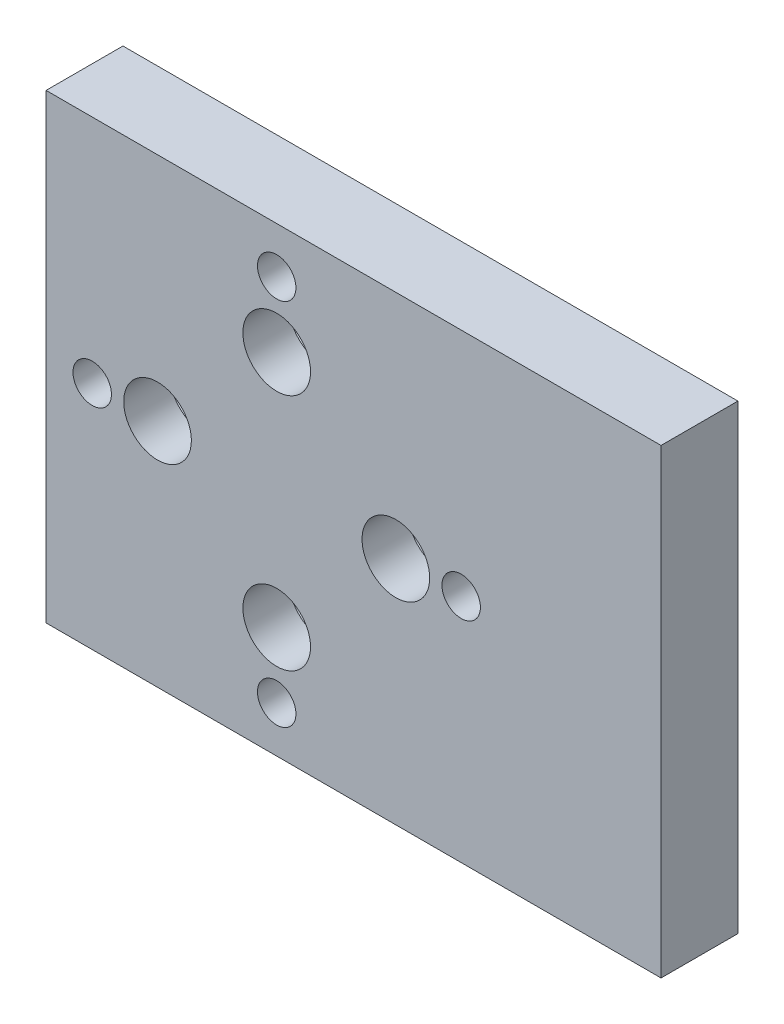
ISO-10303-21;
HEADER;
FILE_DESCRIPTION(('STEP AP214'),'2;1');
FILE_NAME('part.step','',(''),(''),'','','');
FILE_SCHEMA(('AUTOMOTIVE_DESIGN { 1 0 10303 214 1 1 1 1 }'));
ENDSEC;
DATA;
#1=APPLICATION_CONTEXT('core data for automotive mechanical design processes');
#2=APPLICATION_PROTOCOL_DEFINITION('international standard','automotive_design',2000,#1);
#3=PRODUCT_CONTEXT('',#1,'mechanical');
#4=PRODUCT('Part','Part','',(#3));
#5=PRODUCT_RELATED_PRODUCT_CATEGORY('part','',(#4));
#6=PRODUCT_DEFINITION_FORMATION('','',#4);
#7=PRODUCT_DEFINITION_CONTEXT('part definition',#1,'design');
#8=PRODUCT_DEFINITION('design','',#6,#7);
#9=PRODUCT_DEFINITION_SHAPE('','',#8);
#10=(LENGTH_UNIT() NAMED_UNIT(*) SI_UNIT(.MILLI.,.METRE.));
#11=(NAMED_UNIT(*) PLANE_ANGLE_UNIT() SI_UNIT($,.RADIAN.));
#12=(NAMED_UNIT(*) SI_UNIT($,.STERADIAN.) SOLID_ANGLE_UNIT());
#13=UNCERTAINTY_MEASURE_WITH_UNIT(LENGTH_MEASURE(1.E-05),#10,'distance_accuracy_value','');
#14=(GEOMETRIC_REPRESENTATION_CONTEXT(3) GLOBAL_UNCERTAINTY_ASSIGNED_CONTEXT((#13)) GLOBAL_UNIT_ASSIGNED_CONTEXT((#10,
#11,#12)) REPRESENTATION_CONTEXT('',''));
#15=CARTESIAN_POINT('',(0.,0.,0.));
#16=DIRECTION('',(0.,0.,1.));
#17=DIRECTION('',(1.,0.,0.));
#18=AXIS2_PLACEMENT_3D('',#15,#16,#17);
#19=CARTESIAN_POINT('',(40.,30.,10.));
#20=DIRECTION('',(-1.,0.,0.));
#21=DIRECTION('',(0.,0.,1.));
#22=AXIS2_PLACEMENT_3D('',#19,#20,#21);
#23=PLANE('',#22);
#24=DIRECTION('',(0.,1.,0.));
#25=VECTOR('',#24,1.);
#26=CARTESIAN_POINT('',(40.,30.,0.));
#27=LINE('',#26,#25);
#28=CARTESIAN_POINT('',(40.,-30.,0.));
#29=VERTEX_POINT('',#28);
#30=CARTESIAN_POINT('',(40.,30.,0.));
#31=VERTEX_POINT('',#30);
#32=EDGE_CURVE('E167',#29,#31,#27,.T.);
#33=ORIENTED_EDGE('',*,*,#32,.T.);
#34=DIRECTION('',(0.,0.,-1.));
#35=VECTOR('',#34,1.);
#36=CARTESIAN_POINT('',(40.,30.,10.));
#37=LINE('',#36,#35);
#38=CARTESIAN_POINT('',(40.,30.,10.));
#39=VERTEX_POINT('',#38);
#40=EDGE_CURVE('E11',#39,#31,#37,.T.);
#41=ORIENTED_EDGE('',*,*,#40,.F.);
#42=DIRECTION('',(0.,1.,0.));
#43=VECTOR('',#42,1.);
#44=CARTESIAN_POINT('',(40.,30.,10.));
#45=LINE('',#44,#43);
#46=CARTESIAN_POINT('',(40.,-30.,10.));
#47=VERTEX_POINT('',#46);
#48=EDGE_CURVE('E168',#47,#39,#45,.T.);
#49=ORIENTED_EDGE('',*,*,#48,.F.);
#50=DIRECTION('',(0.,0.,-1.));
#51=VECTOR('',#50,1.);
#52=CARTESIAN_POINT('',(40.,-30.,10.));
#53=LINE('',#52,#51);
#54=EDGE_CURVE('E174',#47,#29,#53,.T.);
#55=ORIENTED_EDGE('',*,*,#54,.T.);
#56=EDGE_LOOP('',(#33,#41,#49,#55));
#57=FACE_BOUND('',#56,.T.);
#58=ADVANCED_FACE('F33',(#57),#23,.F.);
#59=CARTESIAN_POINT('',(-40.,30.,10.));
#60=DIRECTION('',(0.,-1.,0.));
#61=DIRECTION('',(0.,0.,-1.));
#62=AXIS2_PLACEMENT_3D('',#59,#60,#61);
#63=PLANE('',#62);
#64=DIRECTION('',(-1.,0.,0.));
#65=VECTOR('',#64,1.);
#66=CARTESIAN_POINT('',(-40.,30.,0.));
#67=LINE('',#66,#65);
#68=CARTESIAN_POINT('',(-40.,30.,0.));
#69=VERTEX_POINT('',#68);
#70=EDGE_CURVE('E177',#31,#69,#67,.T.);
#71=ORIENTED_EDGE('',*,*,#70,.T.);
#72=DIRECTION('',(0.,0.,-1.));
#73=VECTOR('',#72,1.);
#74=CARTESIAN_POINT('',(-40.,30.,10.));
#75=LINE('',#74,#73);
#76=CARTESIAN_POINT('',(-40.,30.,10.));
#77=VERTEX_POINT('',#76);
#78=EDGE_CURVE('E42',#77,#69,#75,.T.);
#79=ORIENTED_EDGE('',*,*,#78,.F.);
#80=DIRECTION('',(-1.,0.,0.));
#81=VECTOR('',#80,1.);
#82=CARTESIAN_POINT('',(-40.,30.,10.));
#83=LINE('',#82,#81);
#84=EDGE_CURVE('E82',#39,#77,#83,.T.);
#85=ORIENTED_EDGE('',*,*,#84,.F.);
#86=ORIENTED_EDGE('',*,*,#40,.T.);
#87=EDGE_LOOP('',(#71,#79,#85,#86));
#88=FACE_BOUND('',#87,.T.);
#89=ADVANCED_FACE('F211',(#88),#63,.F.);
#90=CARTESIAN_POINT('',(-40.,30.,10.));
#91=DIRECTION('',(1.,0.,0.));
#92=DIRECTION('',(0.,0.,-1.));
#93=AXIS2_PLACEMENT_3D('',#90,#91,#92);
#94=PLANE('',#93);
#95=DIRECTION('',(0.,-1.,0.));
#96=VECTOR('',#95,1.);
#97=CARTESIAN_POINT('',(-40.,30.,0.));
#98=LINE('',#97,#96);
#99=CARTESIAN_POINT('',(-40.,-30.,0.));
#100=VERTEX_POINT('',#99);
#101=EDGE_CURVE('E69',#69,#100,#98,.T.);
#102=ORIENTED_EDGE('',*,*,#101,.T.);
#103=DIRECTION('',(0.,0.,-1.));
#104=VECTOR('',#103,1.);
#105=CARTESIAN_POINT('',(-40.,-30.,10.));
#106=LINE('',#105,#104);
#107=CARTESIAN_POINT('',(-40.,-30.,10.));
#108=VERTEX_POINT('',#107);
#109=EDGE_CURVE('E182',#108,#100,#106,.T.);
#110=ORIENTED_EDGE('',*,*,#109,.F.);
#111=DIRECTION('',(0.,-1.,0.));
#112=VECTOR('',#111,1.);
#113=CARTESIAN_POINT('',(-40.,30.,10.));
#114=LINE('',#113,#112);
#115=EDGE_CURVE('E171',#77,#108,#114,.T.);
#116=ORIENTED_EDGE('',*,*,#115,.F.);
#117=ORIENTED_EDGE('',*,*,#78,.T.);
#118=EDGE_LOOP('',(#102,#110,#116,#117));
#119=FACE_BOUND('',#118,.T.);
#120=ADVANCED_FACE('F216',(#119),#94,.F.);
#121=CARTESIAN_POINT('',(-40.,-30.,10.));
#122=DIRECTION('',(0.,1.,0.));
#123=DIRECTION('',(0.,0.,1.));
#124=AXIS2_PLACEMENT_3D('',#121,#122,#123);
#125=PLANE('',#124);
#126=DIRECTION('',(1.,0.,0.));
#127=VECTOR('',#126,1.);
#128=CARTESIAN_POINT('',(-40.,-30.,0.));
#129=LINE('',#128,#127);
#130=EDGE_CURVE('E75',#100,#29,#129,.T.);
#131=ORIENTED_EDGE('',*,*,#130,.T.);
#132=ORIENTED_EDGE('',*,*,#54,.F.);
#133=DIRECTION('',(1.,0.,0.));
#134=VECTOR('',#133,1.);
#135=CARTESIAN_POINT('',(-40.,-30.,10.));
#136=LINE('',#135,#134);
#137=EDGE_CURVE('E51',#108,#47,#136,.T.);
#138=ORIENTED_EDGE('',*,*,#137,.F.);
#139=ORIENTED_EDGE('',*,*,#109,.T.);
#140=EDGE_LOOP('',(#131,#132,#138,#139));
#141=FACE_BOUND('',#140,.T.);
#142=ADVANCED_FACE('F225',(#141),#125,.F.);
#143=CARTESIAN_POINT('',(0.,0.,10.));
#144=DIRECTION('',(0.,0.,1.));
#145=DIRECTION('',(1.,0.,0.));
#146=AXIS2_PLACEMENT_3D('',#143,#144,#145);
#147=PLANE('',#146);
#148=CARTESIAN_POINT('',(-9.99999999999999,24.,10.));
#149=DIRECTION('',(0.,0.,1.));
#150=DIRECTION('',(1.,0.,0.));
#151=AXIS2_PLACEMENT_3D('',#148,#149,#150);
#152=CIRCLE('',#151,2.5);
#153=CARTESIAN_POINT('',(-7.5,24.,10.));
#154=VERTEX_POINT('',#153);
#155=EDGE_CURVE('E106',#154,#154,#152,.T.);
#156=ORIENTED_EDGE('',*,*,#155,.F.);
#157=EDGE_LOOP('',(#156));
#158=FACE_BOUND('',#157,.T.);
#159=CARTESIAN_POINT('',(-34.,0.,10.));
#160=DIRECTION('',(0.,0.,1.));
#161=DIRECTION('',(1.,0.,0.));
#162=AXIS2_PLACEMENT_3D('',#159,#160,#161);
#163=CIRCLE('',#162,2.5);
#164=CARTESIAN_POINT('',(-31.5,0.,10.));
#165=VERTEX_POINT('',#164);
#166=EDGE_CURVE('E105',#165,#165,#163,.T.);
#167=ORIENTED_EDGE('',*,*,#166,.F.);
#168=EDGE_LOOP('',(#167));
#169=FACE_BOUND('',#168,.T.);
#170=CARTESIAN_POINT('',(-9.99999999999999,-24.,10.));
#171=DIRECTION('',(0.,0.,1.));
#172=DIRECTION('',(1.,0.,0.));
#173=AXIS2_PLACEMENT_3D('',#170,#171,#172);
#174=CIRCLE('',#173,2.5);
#175=CARTESIAN_POINT('',(-7.5,-24.,10.));
#176=VERTEX_POINT('',#175);
#177=EDGE_CURVE('E116',#176,#176,#174,.T.);
#178=ORIENTED_EDGE('',*,*,#177,.F.);
#179=EDGE_LOOP('',(#178));
#180=FACE_BOUND('',#179,.T.);
#181=CARTESIAN_POINT('',(14.,0.,10.));
#182=DIRECTION('',(0.,0.,1.));
#183=DIRECTION('',(1.,0.,0.));
#184=AXIS2_PLACEMENT_3D('',#181,#182,#183);
#185=CIRCLE('',#184,2.5);
#186=CARTESIAN_POINT('',(16.5,0.,10.));
#187=VERTEX_POINT('',#186);
#188=EDGE_CURVE('E122',#187,#187,#185,.T.);
#189=ORIENTED_EDGE('',*,*,#188,.F.);
#190=EDGE_LOOP('',(#189));
#191=FACE_BOUND('',#190,.T.);
#192=CARTESIAN_POINT('',(-25.5,0.,10.));
#193=DIRECTION('',(0.,0.,1.));
#194=DIRECTION('',(1.,0.,0.));
#195=AXIS2_PLACEMENT_3D('',#192,#193,#194);
#196=CIRCLE('',#195,4.39999999999999);
#197=CARTESIAN_POINT('',(-21.1,0.,10.));
#198=VERTEX_POINT('',#197);
#199=EDGE_CURVE('E128',#198,#198,#196,.T.);
#200=ORIENTED_EDGE('',*,*,#199,.F.);
#201=EDGE_LOOP('',(#200));
#202=FACE_BOUND('',#201,.T.);
#203=CARTESIAN_POINT('',(-9.99999999999999,15.5,10.));
#204=DIRECTION('',(0.,0.,1.));
#205=DIRECTION('',(1.,0.,0.));
#206=AXIS2_PLACEMENT_3D('',#203,#204,#205);
#207=CIRCLE('',#206,4.39999999999999);
#208=CARTESIAN_POINT('',(-5.6,15.5,10.));
#209=VERTEX_POINT('',#208);
#210=EDGE_CURVE('E134',#209,#209,#207,.T.);
#211=ORIENTED_EDGE('',*,*,#210,.F.);
#212=EDGE_LOOP('',(#211));
#213=FACE_BOUND('',#212,.T.);
#214=CARTESIAN_POINT('',(5.50000000000001,0.,10.));
#215=DIRECTION('',(0.,0.,1.));
#216=DIRECTION('',(1.,0.,0.));
#217=AXIS2_PLACEMENT_3D('',#214,#215,#216);
#218=CIRCLE('',#217,4.39999999999999);
#219=CARTESIAN_POINT('',(9.89999999999999,0.,10.));
#220=VERTEX_POINT('',#219);
#221=EDGE_CURVE('E141',#220,#220,#218,.T.);
#222=ORIENTED_EDGE('',*,*,#221,.F.);
#223=EDGE_LOOP('',(#222));
#224=FACE_BOUND('',#223,.T.);
#225=CARTESIAN_POINT('',(-9.99999999999999,-15.5,10.));
#226=DIRECTION('',(0.,0.,1.));
#227=DIRECTION('',(1.,0.,0.));
#228=AXIS2_PLACEMENT_3D('',#225,#226,#227);
#229=CIRCLE('',#228,4.39999999999999);
#230=CARTESIAN_POINT('',(-5.6,-15.5,10.));
#231=VERTEX_POINT('',#230);
#232=EDGE_CURVE('E148',#231,#231,#229,.T.);
#233=ORIENTED_EDGE('',*,*,#232,.F.);
#234=EDGE_LOOP('',(#233));
#235=FACE_BOUND('',#234,.T.);
#236=ORIENTED_EDGE('',*,*,#48,.T.);
#237=ORIENTED_EDGE('',*,*,#84,.T.);
#238=ORIENTED_EDGE('',*,*,#115,.T.);
#239=ORIENTED_EDGE('',*,*,#137,.T.);
#240=EDGE_LOOP('',(#236,#237,#238,#239));
#241=FACE_BOUND('',#240,.T.);
#242=ADVANCED_FACE('F223',(#158,#169,#180,#191,#202,#213,#224,#235,#241),#147,.T.);
#243=CARTESIAN_POINT('',(0.,0.,0.));
#244=DIRECTION('',(0.,0.,1.));
#245=DIRECTION('',(1.,0.,0.));
#246=AXIS2_PLACEMENT_3D('',#243,#244,#245);
#247=PLANE('',#246);
#248=CARTESIAN_POINT('',(-25.5,0.,0.));
#249=DIRECTION('',(0.,0.,1.));
#250=DIRECTION('',(1.,0.,0.));
#251=AXIS2_PLACEMENT_3D('',#248,#249,#250);
#252=CIRCLE('',#251,2.1);
#253=CARTESIAN_POINT('',(-23.4,0.,0.));
#254=VERTEX_POINT('',#253);
#255=EDGE_CURVE('E155',#254,#254,#252,.T.);
#256=ORIENTED_EDGE('',*,*,#255,.T.);
#257=EDGE_LOOP('',(#256));
#258=FACE_BOUND('',#257,.T.);
#259=CARTESIAN_POINT('',(-9.99999999999999,-15.5,0.));
#260=DIRECTION('',(0.,0.,1.));
#261=DIRECTION('',(1.,0.,0.));
#262=AXIS2_PLACEMENT_3D('',#259,#260,#261);
#263=CIRCLE('',#262,2.1);
#264=CARTESIAN_POINT('',(-7.89999999999999,-15.5,0.));
#265=VERTEX_POINT('',#264);
#266=EDGE_CURVE('E158',#265,#265,#263,.T.);
#267=ORIENTED_EDGE('',*,*,#266,.T.);
#268=EDGE_LOOP('',(#267));
#269=FACE_BOUND('',#268,.T.);
#270=CARTESIAN_POINT('',(5.50000000000001,0.,0.));
#271=DIRECTION('',(0.,0.,1.));
#272=DIRECTION('',(1.,0.,0.));
#273=AXIS2_PLACEMENT_3D('',#270,#271,#272);
#274=CIRCLE('',#273,2.1);
#275=CARTESIAN_POINT('',(7.6,0.,0.));
#276=VERTEX_POINT('',#275);
#277=EDGE_CURVE('E161',#276,#276,#274,.T.);
#278=ORIENTED_EDGE('',*,*,#277,.T.);
#279=EDGE_LOOP('',(#278));
#280=FACE_BOUND('',#279,.T.);
#281=CARTESIAN_POINT('',(-9.99999999999999,15.5,0.));
#282=DIRECTION('',(0.,0.,1.));
#283=DIRECTION('',(1.,0.,0.));
#284=AXIS2_PLACEMENT_3D('',#281,#282,#283);
#285=CIRCLE('',#284,2.1);
#286=CARTESIAN_POINT('',(-7.89999999999999,15.5,0.));
#287=VERTEX_POINT('',#286);
#288=EDGE_CURVE('E164',#287,#287,#285,.T.);
#289=ORIENTED_EDGE('',*,*,#288,.T.);
#290=EDGE_LOOP('',(#289));
#291=FACE_BOUND('',#290,.T.);
#292=ORIENTED_EDGE('',*,*,#32,.F.);
#293=ORIENTED_EDGE('',*,*,#130,.F.);
#294=ORIENTED_EDGE('',*,*,#101,.F.);
#295=ORIENTED_EDGE('',*,*,#70,.F.);
#296=EDGE_LOOP('',(#292,#293,#294,#295));
#297=FACE_BOUND('',#296,.T.);
#298=ADVANCED_FACE('F221',(#258,#269,#280,#291,#297),#247,.F.);
#299=CARTESIAN_POINT('',(-9.99999999999999,15.5,10.));
#300=DIRECTION('',(0.,0.,1.));
#301=DIRECTION('',(1.,0.,0.));
#302=AXIS2_PLACEMENT_3D('',#299,#300,#301);
#303=CYLINDRICAL_SURFACE('',#302,2.09999999999999);
#304=CARTESIAN_POINT('',(-9.99999999999999,15.5,2.6180205762366));
#305=DIRECTION('',(0.,0.,1.));
#306=DIRECTION('',(1.,0.,0.));
#307=AXIS2_PLACEMENT_3D('',#304,#305,#306);
#308=CIRCLE('',#307,2.09999999999999);
#309=CARTESIAN_POINT('',(-7.9,15.5,2.6180205762366));
#310=VERTEX_POINT('',#309);
#311=EDGE_CURVE('E140',#310,#310,#308,.T.);
#312=ORIENTED_EDGE('',*,*,#311,.T.);
#313=EDGE_LOOP('',(#312));
#314=FACE_BOUND('',#313,.T.);
#315=ORIENTED_EDGE('',*,*,#288,.F.);
#316=EDGE_LOOP('',(#315));
#317=FACE_BOUND('',#316,.T.);
#318=ADVANCED_FACE('F191',(#314,#317),#303,.F.);
#319=CARTESIAN_POINT('',(5.50000000000001,0.,10.));
#320=DIRECTION('',(0.,0.,1.));
#321=DIRECTION('',(1.,0.,0.));
#322=AXIS2_PLACEMENT_3D('',#319,#320,#321);
#323=CYLINDRICAL_SURFACE('',#322,2.09999999999999);
#324=CARTESIAN_POINT('',(5.50000000000001,0.,2.6180205762366));
#325=DIRECTION('',(0.,0.,1.));
#326=DIRECTION('',(1.,0.,0.));
#327=AXIS2_PLACEMENT_3D('',#324,#325,#326);
#328=CIRCLE('',#327,2.09999999999999);
#329=CARTESIAN_POINT('',(7.6,0.,2.6180205762366));
#330=VERTEX_POINT('',#329);
#331=EDGE_CURVE('E147',#330,#330,#328,.T.);
#332=ORIENTED_EDGE('',*,*,#331,.T.);
#333=EDGE_LOOP('',(#332));
#334=FACE_BOUND('',#333,.T.);
#335=ORIENTED_EDGE('',*,*,#277,.F.);
#336=EDGE_LOOP('',(#335));
#337=FACE_BOUND('',#336,.T.);
#338=ADVANCED_FACE('F265',(#334,#337),#323,.F.);
#339=CARTESIAN_POINT('',(-9.99999999999999,-15.5,10.));
#340=DIRECTION('',(0.,0.,1.));
#341=DIRECTION('',(1.,0.,0.));
#342=AXIS2_PLACEMENT_3D('',#339,#340,#341);
#343=CYLINDRICAL_SURFACE('',#342,2.09999999999999);
#344=CARTESIAN_POINT('',(-9.99999999999999,-15.5,2.6180205762366));
#345=DIRECTION('',(0.,0.,1.));
#346=DIRECTION('',(1.,0.,0.));
#347=AXIS2_PLACEMENT_3D('',#344,#345,#346);
#348=CIRCLE('',#347,2.09999999999999);
#349=CARTESIAN_POINT('',(-7.9,-15.5,2.6180205762366));
#350=VERTEX_POINT('',#349);
#351=EDGE_CURVE('E154',#350,#350,#348,.T.);
#352=ORIENTED_EDGE('',*,*,#351,.T.);
#353=EDGE_LOOP('',(#352));
#354=FACE_BOUND('',#353,.T.);
#355=ORIENTED_EDGE('',*,*,#266,.F.);
#356=EDGE_LOOP('',(#355));
#357=FACE_BOUND('',#356,.T.);
#358=ADVANCED_FACE('F273',(#354,#357),#343,.F.);
#359=CARTESIAN_POINT('',(-25.5,0.,10.));
#360=DIRECTION('',(0.,0.,1.));
#361=DIRECTION('',(1.,0.,0.));
#362=AXIS2_PLACEMENT_3D('',#359,#360,#361);
#363=CYLINDRICAL_SURFACE('',#362,2.09999999999999);
#364=CARTESIAN_POINT('',(-25.5,0.,2.6180205762366));
#365=DIRECTION('',(0.,0.,1.));
#366=DIRECTION('',(1.,0.,0.));
#367=AXIS2_PLACEMENT_3D('',#364,#365,#366);
#368=CIRCLE('',#367,2.09999999999999);
#369=CARTESIAN_POINT('',(-23.4,0.,2.6180205762366));
#370=VERTEX_POINT('',#369);
#371=EDGE_CURVE('E36',#370,#370,#368,.T.);
#372=ORIENTED_EDGE('',*,*,#371,.T.);
#373=EDGE_LOOP('',(#372));
#374=FACE_BOUND('',#373,.T.);
#375=ORIENTED_EDGE('',*,*,#255,.F.);
#376=EDGE_LOOP('',(#375));
#377=FACE_BOUND('',#376,.T.);
#378=ADVANCED_FACE('F282',(#374,#377),#363,.F.);
#379=CARTESIAN_POINT('',(-9.99999999999999,-15.5,4.));
#380=DIRECTION('',(0.,0.,1.));
#381=DIRECTION('',(1.,0.,0.));
#382=AXIS2_PLACEMENT_3D('',#379,#380,#381);
#383=CONICAL_SURFACE('',#382,4.4,1.02974425867665);
#384=CARTESIAN_POINT('',(-9.99999999999999,-15.5,4.));
#385=DIRECTION('',(0.,0.,1.));
#386=DIRECTION('',(1.,0.,0.));
#387=AXIS2_PLACEMENT_3D('',#384,#385,#386);
#388=CIRCLE('',#387,4.4);
#389=CARTESIAN_POINT('',(-5.59999999999999,-15.5,4.));
#390=VERTEX_POINT('',#389);
#391=EDGE_CURVE('E151',#390,#390,#388,.T.);
#392=ORIENTED_EDGE('',*,*,#391,.T.);
#393=EDGE_LOOP('',(#392));
#394=FACE_BOUND('',#393,.T.);
#395=ORIENTED_EDGE('',*,*,#351,.F.);
#396=EDGE_LOOP('',(#395));
#397=FACE_BOUND('',#396,.T.);
#398=ADVANCED_FACE('F292',(#394,#397),#383,.F.);
#399=CARTESIAN_POINT('',(-9.99999999999999,-15.5,10.));
#400=DIRECTION('',(0.,0.,1.));
#401=DIRECTION('',(1.,0.,0.));
#402=AXIS2_PLACEMENT_3D('',#399,#400,#401);
#403=CYLINDRICAL_SURFACE('',#402,4.39999999999999);
#404=ORIENTED_EDGE('',*,*,#391,.F.);
#405=EDGE_LOOP('',(#404));
#406=FACE_BOUND('',#405,.T.);
#407=ORIENTED_EDGE('',*,*,#232,.T.);
#408=EDGE_LOOP('',(#407));
#409=FACE_BOUND('',#408,.T.);
#410=ADVANCED_FACE('F302',(#406,#409),#403,.F.);
#411=CARTESIAN_POINT('',(5.50000000000001,0.,4.));
#412=DIRECTION('',(0.,0.,1.));
#413=DIRECTION('',(1.,0.,0.));
#414=AXIS2_PLACEMENT_3D('',#411,#412,#413);
#415=CONICAL_SURFACE('',#414,4.4,1.02974425867665);
#416=CARTESIAN_POINT('',(5.50000000000001,0.,4.));
#417=DIRECTION('',(0.,0.,1.));
#418=DIRECTION('',(1.,0.,0.));
#419=AXIS2_PLACEMENT_3D('',#416,#417,#418);
#420=CIRCLE('',#419,4.4);
#421=CARTESIAN_POINT('',(9.9,0.,4.));
#422=VERTEX_POINT('',#421);
#423=EDGE_CURVE('E144',#422,#422,#420,.T.);
#424=ORIENTED_EDGE('',*,*,#423,.T.);
#425=EDGE_LOOP('',(#424));
#426=FACE_BOUND('',#425,.T.);
#427=ORIENTED_EDGE('',*,*,#331,.F.);
#428=EDGE_LOOP('',(#427));
#429=FACE_BOUND('',#428,.T.);
#430=ADVANCED_FACE('F207',(#426,#429),#415,.F.);
#431=CARTESIAN_POINT('',(5.50000000000001,0.,10.));
#432=DIRECTION('',(0.,0.,1.));
#433=DIRECTION('',(1.,0.,0.));
#434=AXIS2_PLACEMENT_3D('',#431,#432,#433);
#435=CYLINDRICAL_SURFACE('',#434,4.39999999999999);
#436=ORIENTED_EDGE('',*,*,#423,.F.);
#437=EDGE_LOOP('',(#436));
#438=FACE_BOUND('',#437,.T.);
#439=ORIENTED_EDGE('',*,*,#221,.T.);
#440=EDGE_LOOP('',(#439));
#441=FACE_BOUND('',#440,.T.);
#442=ADVANCED_FACE('F197',(#438,#441),#435,.F.);
#443=CARTESIAN_POINT('',(-9.99999999999999,15.5,4.));
#444=DIRECTION('',(0.,0.,1.));
#445=DIRECTION('',(1.,0.,0.));
#446=AXIS2_PLACEMENT_3D('',#443,#444,#445);
#447=CONICAL_SURFACE('',#446,4.4,1.02974425867665);
#448=CARTESIAN_POINT('',(-9.99999999999999,15.5,4.));
#449=DIRECTION('',(0.,0.,1.));
#450=DIRECTION('',(1.,0.,0.));
#451=AXIS2_PLACEMENT_3D('',#448,#449,#450);
#452=CIRCLE('',#451,4.4);
#453=CARTESIAN_POINT('',(-5.59999999999999,15.5,4.));
#454=VERTEX_POINT('',#453);
#455=EDGE_CURVE('E137',#454,#454,#452,.T.);
#456=ORIENTED_EDGE('',*,*,#455,.T.);
#457=EDGE_LOOP('',(#456));
#458=FACE_BOUND('',#457,.T.);
#459=ORIENTED_EDGE('',*,*,#311,.F.);
#460=EDGE_LOOP('',(#459));
#461=FACE_BOUND('',#460,.T.);
#462=ADVANCED_FACE('F194',(#458,#461),#447,.F.);
#463=CARTESIAN_POINT('',(-9.99999999999999,15.5,10.));
#464=DIRECTION('',(0.,0.,1.));
#465=DIRECTION('',(1.,0.,0.));
#466=AXIS2_PLACEMENT_3D('',#463,#464,#465);
#467=CYLINDRICAL_SURFACE('',#466,4.39999999999999);
#468=ORIENTED_EDGE('',*,*,#455,.F.);
#469=EDGE_LOOP('',(#468));
#470=FACE_BOUND('',#469,.T.);
#471=ORIENTED_EDGE('',*,*,#210,.T.);
#472=EDGE_LOOP('',(#471));
#473=FACE_BOUND('',#472,.T.);
#474=ADVANCED_FACE('F196',(#470,#473),#467,.F.);
#475=CARTESIAN_POINT('',(-25.5,0.,4.));
#476=DIRECTION('',(0.,0.,1.));
#477=DIRECTION('',(1.,0.,0.));
#478=AXIS2_PLACEMENT_3D('',#475,#476,#477);
#479=CONICAL_SURFACE('',#478,4.4,1.02974425867665);
#480=CARTESIAN_POINT('',(-25.5,0.,4.));
#481=DIRECTION('',(0.,0.,1.));
#482=DIRECTION('',(1.,0.,0.));
#483=AXIS2_PLACEMENT_3D('',#480,#481,#482);
#484=CIRCLE('',#483,4.4);
#485=CARTESIAN_POINT('',(-21.1,0.,4.));
#486=VERTEX_POINT('',#485);
#487=EDGE_CURVE('E131',#486,#486,#484,.T.);
#488=ORIENTED_EDGE('',*,*,#487,.T.);
#489=EDGE_LOOP('',(#488));
#490=FACE_BOUND('',#489,.T.);
#491=ORIENTED_EDGE('',*,*,#371,.F.);
#492=EDGE_LOOP('',(#491));
#493=FACE_BOUND('',#492,.T.);
#494=ADVANCED_FACE('F204',(#490,#493),#479,.F.);
#495=CARTESIAN_POINT('',(-25.5,0.,10.));
#496=DIRECTION('',(0.,0.,1.));
#497=DIRECTION('',(1.,0.,0.));
#498=AXIS2_PLACEMENT_3D('',#495,#496,#497);
#499=CYLINDRICAL_SURFACE('',#498,4.39999999999999);
#500=ORIENTED_EDGE('',*,*,#487,.F.);
#501=EDGE_LOOP('',(#500));
#502=FACE_BOUND('',#501,.T.);
#503=ORIENTED_EDGE('',*,*,#199,.T.);
#504=EDGE_LOOP('',(#503));
#505=FACE_BOUND('',#504,.T.);
#506=ADVANCED_FACE('F346',(#502,#505),#499,.F.);
#507=CARTESIAN_POINT('',(14.,0.,5.));
#508=DIRECTION('',(0.,0.,1.));
#509=DIRECTION('',(1.,0.,0.));
#510=AXIS2_PLACEMENT_3D('',#507,#508,#509);
#511=CONICAL_SURFACE('',#510,2.5,1.02974425867665);
#512=CARTESIAN_POINT('',(14.,0.,3.4978484524311));
#513=VERTEX_POINT('',#512);
#514=VERTEX_LOOP('',#513);
#515=FACE_BOUND('',#514,.T.);
#516=CARTESIAN_POINT('',(14.,0.,5.));
#517=DIRECTION('',(0.,0.,1.));
#518=DIRECTION('',(1.,0.,0.));
#519=AXIS2_PLACEMENT_3D('',#516,#517,#518);
#520=CIRCLE('',#519,2.5);
#521=CARTESIAN_POINT('',(16.5,0.,5.));
#522=VERTEX_POINT('',#521);
#523=EDGE_CURVE('E125',#522,#522,#520,.T.);
#524=ORIENTED_EDGE('',*,*,#523,.T.);
#525=EDGE_LOOP('',(#524));
#526=FACE_BOUND('',#525,.T.);
#527=ADVANCED_FACE('F355',(#515,#526),#511,.F.);
#528=CARTESIAN_POINT('',(14.,0.,10.));
#529=DIRECTION('',(0.,0.,1.));
#530=DIRECTION('',(1.,0.,0.));
#531=AXIS2_PLACEMENT_3D('',#528,#529,#530);
#532=CYLINDRICAL_SURFACE('',#531,2.5);
#533=ORIENTED_EDGE('',*,*,#523,.F.);
#534=EDGE_LOOP('',(#533));
#535=FACE_BOUND('',#534,.T.);
#536=ORIENTED_EDGE('',*,*,#188,.T.);
#537=EDGE_LOOP('',(#536));
#538=FACE_BOUND('',#537,.T.);
#539=ADVANCED_FACE('F369',(#535,#538),#532,.F.);
#540=CARTESIAN_POINT('',(-9.99999999999999,-24.,5.));
#541=DIRECTION('',(0.,0.,1.));
#542=DIRECTION('',(1.,0.,0.));
#543=AXIS2_PLACEMENT_3D('',#540,#541,#542);
#544=CONICAL_SURFACE('',#543,2.5,1.02974425867665);
#545=CARTESIAN_POINT('',(-10.,-24.,3.4978484524311));
#546=VERTEX_POINT('',#545);
#547=VERTEX_LOOP('',#546);
#548=FACE_BOUND('',#547,.T.);
#549=CARTESIAN_POINT('',(-9.99999999999999,-24.,5.));
#550=DIRECTION('',(0.,0.,1.));
#551=DIRECTION('',(1.,0.,0.));
#552=AXIS2_PLACEMENT_3D('',#549,#550,#551);
#553=CIRCLE('',#552,2.5);
#554=CARTESIAN_POINT('',(-7.5,-24.,5.));
#555=VERTEX_POINT('',#554);
#556=EDGE_CURVE('E119',#555,#555,#553,.T.);
#557=ORIENTED_EDGE('',*,*,#556,.T.);
#558=EDGE_LOOP('',(#557));
#559=FACE_BOUND('',#558,.T.);
#560=ADVANCED_FACE('F379',(#548,#559),#544,.F.);
#561=CARTESIAN_POINT('',(-9.99999999999999,-24.,10.));
#562=DIRECTION('',(0.,0.,1.));
#563=DIRECTION('',(1.,0.,0.));
#564=AXIS2_PLACEMENT_3D('',#561,#562,#563);
#565=CYLINDRICAL_SURFACE('',#564,2.5);
#566=ORIENTED_EDGE('',*,*,#556,.F.);
#567=EDGE_LOOP('',(#566));
#568=FACE_BOUND('',#567,.T.);
#569=ORIENTED_EDGE('',*,*,#177,.T.);
#570=EDGE_LOOP('',(#569));
#571=FACE_BOUND('',#570,.T.);
#572=ADVANCED_FACE('F389',(#568,#571),#565,.F.);
#573=CARTESIAN_POINT('',(-34.,0.,5.));
#574=DIRECTION('',(0.,0.,1.));
#575=DIRECTION('',(1.,0.,0.));
#576=AXIS2_PLACEMENT_3D('',#573,#574,#575);
#577=CONICAL_SURFACE('',#576,2.5,1.02974425867665);
#578=CARTESIAN_POINT('',(-34.,0.,3.4978484524311));
#579=VERTEX_POINT('',#578);
#580=VERTEX_LOOP('',#579);
#581=FACE_BOUND('',#580,.T.);
#582=CARTESIAN_POINT('',(-34.,0.,5.));
#583=DIRECTION('',(0.,0.,1.));
#584=DIRECTION('',(1.,0.,0.));
#585=AXIS2_PLACEMENT_3D('',#582,#583,#584);
#586=CIRCLE('',#585,2.5);
#587=CARTESIAN_POINT('',(-31.5,0.,5.));
#588=VERTEX_POINT('',#587);
#589=EDGE_CURVE('E109',#588,#588,#586,.T.);
#590=ORIENTED_EDGE('',*,*,#589,.T.);
#591=EDGE_LOOP('',(#590));
#592=FACE_BOUND('',#591,.T.);
#593=ADVANCED_FACE('F399',(#581,#592),#577,.F.);
#594=CARTESIAN_POINT('',(-34.,0.,10.));
#595=DIRECTION('',(0.,0.,1.));
#596=DIRECTION('',(1.,0.,0.));
#597=AXIS2_PLACEMENT_3D('',#594,#595,#596);
#598=CYLINDRICAL_SURFACE('',#597,2.5);
#599=ORIENTED_EDGE('',*,*,#589,.F.);
#600=EDGE_LOOP('',(#599));
#601=FACE_BOUND('',#600,.T.);
#602=ORIENTED_EDGE('',*,*,#166,.T.);
#603=EDGE_LOOP('',(#602));
#604=FACE_BOUND('',#603,.T.);
#605=ADVANCED_FACE('F99',(#601,#604),#598,.F.);
#606=CARTESIAN_POINT('',(-9.99999999999999,24.,5.));
#607=DIRECTION('',(0.,0.,1.));
#608=DIRECTION('',(1.,0.,0.));
#609=AXIS2_PLACEMENT_3D('',#606,#607,#608);
#610=CONICAL_SURFACE('',#609,2.5,1.02974425867665);
#611=CARTESIAN_POINT('',(-10.,24.,3.4978484524311));
#612=VERTEX_POINT('',#611);
#613=VERTEX_LOOP('',#612);
#614=FACE_BOUND('',#613,.T.);
#615=CARTESIAN_POINT('',(-9.99999999999999,24.,5.));
#616=DIRECTION('',(0.,0.,1.));
#617=DIRECTION('',(1.,0.,0.));
#618=AXIS2_PLACEMENT_3D('',#615,#616,#617);
#619=CIRCLE('',#618,2.5);
#620=CARTESIAN_POINT('',(-7.5,24.,5.));
#621=VERTEX_POINT('',#620);
#622=EDGE_CURVE('E103',#621,#621,#619,.T.);
#623=ORIENTED_EDGE('',*,*,#622,.T.);
#624=EDGE_LOOP('',(#623));
#625=FACE_BOUND('',#624,.T.);
#626=ADVANCED_FACE('F95',(#614,#625),#610,.F.);
#627=CARTESIAN_POINT('',(-9.99999999999999,24.,10.));
#628=DIRECTION('',(0.,0.,1.));
#629=DIRECTION('',(1.,0.,0.));
#630=AXIS2_PLACEMENT_3D('',#627,#628,#629);
#631=CYLINDRICAL_SURFACE('',#630,2.5);
#632=ORIENTED_EDGE('',*,*,#622,.F.);
#633=EDGE_LOOP('',(#632));
#634=FACE_BOUND('',#633,.T.);
#635=ORIENTED_EDGE('',*,*,#155,.T.);
#636=EDGE_LOOP('',(#635));
#637=FACE_BOUND('',#636,.T.);
#638=ADVANCED_FACE('F98',(#634,#637),#631,.F.);
#639=CLOSED_SHELL('',(#58,#89,#120,#142,#242,#298,#318,#338,#358,#378,#398,#410,#430,#442,#462,
#474,#494,#506,#527,#539,#560,#572,#593,#605,#626,#638));
#640=MANIFOLD_SOLID_BREP('B2',#639);
#641=ADVANCED_BREP_SHAPE_REPRESENTATION('',(#18,#640),#14);
#642=SHAPE_DEFINITION_REPRESENTATION(#9,#641);
ENDSEC;
END-ISO-10303-21;
